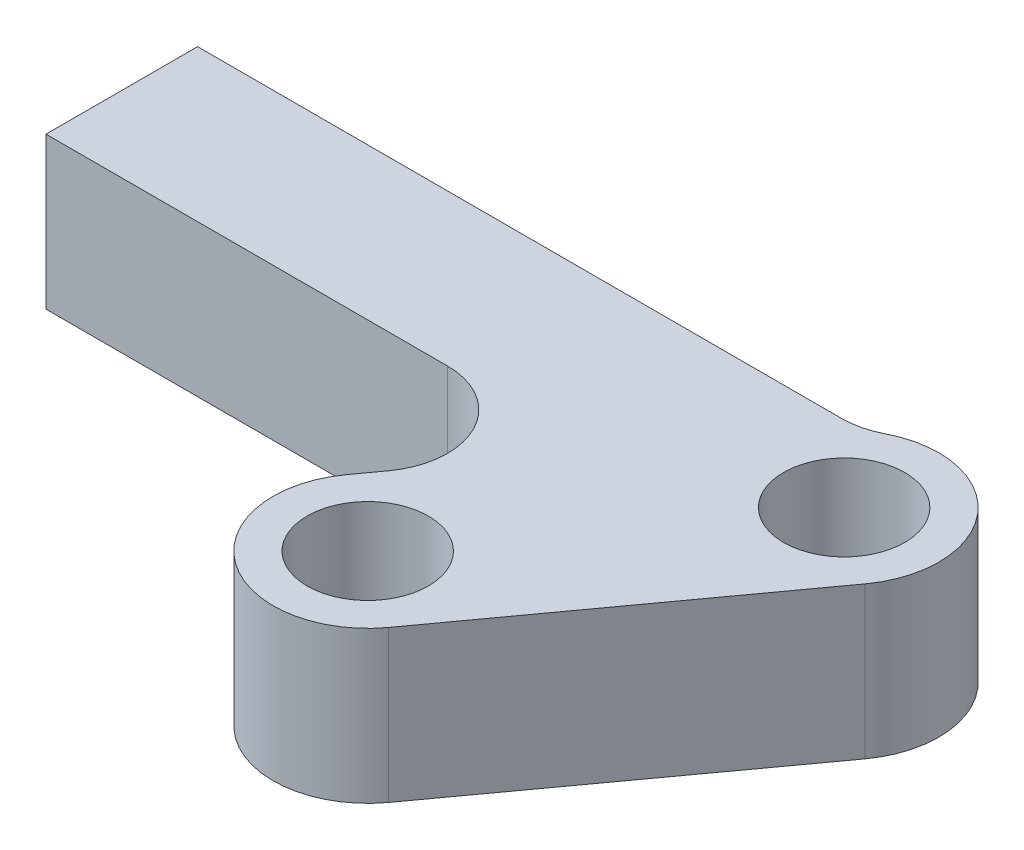
ISO-10303-21;
HEADER;
FILE_DESCRIPTION(('STEP AP214'),'2;1');
FILE_NAME('part.step','',(''),(''),'','','');
FILE_SCHEMA(('AUTOMOTIVE_DESIGN { 1 0 10303 214 1 1 1 1 }'));
ENDSEC;
DATA;
#1=APPLICATION_CONTEXT('core data for automotive mechanical design processes');
#2=APPLICATION_PROTOCOL_DEFINITION('international standard','automotive_design',2000,#1);
#3=PRODUCT_CONTEXT('',#1,'mechanical');
#4=PRODUCT('Part','Part','',(#3));
#5=PRODUCT_RELATED_PRODUCT_CATEGORY('part','',(#4));
#6=PRODUCT_DEFINITION_FORMATION('','',#4);
#7=PRODUCT_DEFINITION_CONTEXT('part definition',#1,'design');
#8=PRODUCT_DEFINITION('design','',#6,#7);
#9=PRODUCT_DEFINITION_SHAPE('','',#8);
#10=(LENGTH_UNIT() NAMED_UNIT(*) SI_UNIT(.MILLI.,.METRE.));
#11=(NAMED_UNIT(*) PLANE_ANGLE_UNIT() SI_UNIT($,.RADIAN.));
#12=(NAMED_UNIT(*) SI_UNIT($,.STERADIAN.) SOLID_ANGLE_UNIT());
#13=UNCERTAINTY_MEASURE_WITH_UNIT(LENGTH_MEASURE(1.E-05),#10,'distance_accuracy_value','');
#14=(GEOMETRIC_REPRESENTATION_CONTEXT(3) GLOBAL_UNCERTAINTY_ASSIGNED_CONTEXT((#13)) GLOBAL_UNIT_ASSIGNED_CONTEXT((#10,
#11,#12)) REPRESENTATION_CONTEXT('',''));
#15=CARTESIAN_POINT('',(0.,0.,0.));
#16=DIRECTION('',(0.,0.,1.));
#17=DIRECTION('',(1.,0.,0.));
#18=AXIS2_PLACEMENT_3D('',#15,#16,#17);
#19=CARTESIAN_POINT('',(-2.06155281280883,4.,-4.));
#20=DIRECTION('',(0.,1.,0.));
#21=DIRECTION('',(0.,0.,1.));
#22=AXIS2_PLACEMENT_3D('',#19,#20,#21);
#23=PLANE('',#22);
#24=CARTESIAN_POINT('',(0.,4.,0.));
#25=DIRECTION('',(0.,1.,0.));
#26=DIRECTION('',(0.,0.,1.));
#27=AXIS2_PLACEMENT_3D('',#24,#25,#26);
#28=CIRCLE('',#27,1.6);
#29=CARTESIAN_POINT('',(0.,4.,1.6));
#30=VERTEX_POINT('',#29);
#31=EDGE_CURVE('E142',#30,#30,#28,.T.);
#32=ORIENTED_EDGE('',*,*,#31,.F.);
#33=EDGE_LOOP('',(#32));
#34=FACE_BOUND('',#33,.T.);
#35=CARTESIAN_POINT('',(-2.06155281280883,4.,-4.));
#36=DIRECTION('',(0.,-1.,0.));
#37=DIRECTION('',(0.,0.,1.));
#38=AXIS2_PLACEMENT_3D('',#35,#36,#37);
#39=CIRCLE('',#38,2.);
#40=CARTESIAN_POINT('',(-1.14530711822713,4.,-2.22222222222222));
#41=VERTEX_POINT('',#40);
#42=CARTESIAN_POINT('',(-2.06155281280883,4.,-2.));
#43=VERTEX_POINT('',#42);
#44=EDGE_CURVE('E155',#41,#43,#39,.T.);
#45=ORIENTED_EDGE('',*,*,#44,.T.);
#46=DIRECTION('',(-1.,0.,0.));
#47=VECTOR('',#46,1.);
#48=CARTESIAN_POINT('',(-19.0615528128088,4.,-2.));
#49=LINE('',#48,#47);
#50=CARTESIAN_POINT('',(-19.0615528128088,4.,-2.));
#51=VERTEX_POINT('',#50);
#52=EDGE_CURVE('E98',#43,#51,#49,.T.);
#53=ORIENTED_EDGE('',*,*,#52,.T.);
#54=DIRECTION('',(0.,0.,1.));
#55=VECTOR('',#54,1.);
#56=CARTESIAN_POINT('',(-19.0615528128088,4.,2.));
#57=LINE('',#56,#55);
#58=CARTESIAN_POINT('',(-19.0615528128088,4.,2.));
#59=VERTEX_POINT('',#58);
#60=EDGE_CURVE('E173',#51,#59,#57,.T.);
#61=ORIENTED_EDGE('',*,*,#60,.T.);
#62=DIRECTION('',(1.,0.,0.));
#63=VECTOR('',#62,1.);
#64=CARTESIAN_POINT('',(-19.0615528128088,4.,2.));
#65=LINE('',#64,#63);
#66=CARTESIAN_POINT('',(-8.46847601077048,4.,2.));
#67=VERTEX_POINT('',#66);
#68=EDGE_CURVE('E190',#59,#67,#65,.T.);
#69=ORIENTED_EDGE('',*,*,#68,.T.);
#70=CARTESIAN_POINT('',(-8.46847601077048,4.,4.));
#71=DIRECTION('',(0.,-1.,0.));
#72=DIRECTION('',(0.,0.,-1.));
#73=AXIS2_PLACEMENT_3D('',#70,#71,#72);
#74=CIRCLE('',#73,2.);
#75=CARTESIAN_POINT('',(-6.85044202202058,4.,5.17557050458494));
#76=VERTEX_POINT('',#75);
#77=EDGE_CURVE('E189',#67,#76,#74,.T.);
#78=ORIENTED_EDGE('',*,*,#77,.T.);
#79=DIRECTION('',(-0.587785252292471,0.,0.809016994374949));
#80=VECTOR('',#79,1.);
#81=CARTESIAN_POINT('',(-6.85044202202058,4.,5.17557050458494));
#82=LINE('',#81,#80);
#83=CARTESIAN_POINT('',(-7.31260975656961,4.,5.81168981864336));
#84=VERTEX_POINT('',#83);
#85=EDGE_CURVE('E120',#76,#84,#82,.T.);
#86=ORIENTED_EDGE('',*,*,#85,.T.);
#87=CARTESIAN_POINT('',(-5.29006727063224,4.,7.28115294937454));
#88=DIRECTION('',(0.,1.,0.));
#89=DIRECTION('',(0.,0.,1.));
#90=AXIS2_PLACEMENT_3D('',#87,#88,#89);
#91=CIRCLE('',#90,2.5);
#92=CARTESIAN_POINT('',(-3.26752478469487,4.,8.75061608010572));
#93=VERTEX_POINT('',#92);
#94=EDGE_CURVE('E114',#84,#93,#91,.T.);
#95=ORIENTED_EDGE('',*,*,#94,.T.);
#96=DIRECTION('',(0.587785252292471,0.,-0.809016994374949));
#97=VECTOR('',#96,1.);
#98=CARTESIAN_POINT('',(2.02254248593737,4.,1.46946313073118));
#99=LINE('',#98,#97);
#100=CARTESIAN_POINT('',(2.02254248593737,4.,1.46946313073118));
#101=VERTEX_POINT('',#100);
#102=EDGE_CURVE('E118',#93,#101,#99,.T.);
#103=ORIENTED_EDGE('',*,*,#102,.T.);
#104=CARTESIAN_POINT('',(0.,4.,0.));
#105=DIRECTION('',(0.,1.,0.));
#106=DIRECTION('',(0.,0.,1.));
#107=AXIS2_PLACEMENT_3D('',#104,#105,#106);
#108=CIRCLE('',#107,2.5);
#109=EDGE_CURVE('E52',#101,#41,#108,.T.);
#110=ORIENTED_EDGE('',*,*,#109,.T.);
#111=EDGE_LOOP('',(#45,#53,#61,#69,#78,#86,#95,#103,#110));
#112=FACE_BOUND('',#111,.T.);
#113=CARTESIAN_POINT('',(-5.29006727063224,4.,7.28115294937454));
#114=DIRECTION('',(0.,1.,0.));
#115=DIRECTION('',(0.,0.,1.));
#116=AXIS2_PLACEMENT_3D('',#113,#114,#115);
#117=CIRCLE('',#116,1.6);
#118=CARTESIAN_POINT('',(-5.29006727063224,4.,8.88115294937453));
#119=VERTEX_POINT('',#118);
#120=EDGE_CURVE('E200',#119,#119,#117,.T.);
#121=ORIENTED_EDGE('',*,*,#120,.F.);
#122=EDGE_LOOP('',(#121));
#123=FACE_BOUND('',#122,.T.);
#124=ADVANCED_FACE('F35',(#34,#112,#123),#23,.T.);
#125=CARTESIAN_POINT('',(-2.06155281280883,0.,-4.));
#126=DIRECTION('',(0.,1.,0.));
#127=DIRECTION('',(0.,0.,1.));
#128=AXIS2_PLACEMENT_3D('',#125,#126,#127);
#129=PLANE('',#128);
#130=CARTESIAN_POINT('',(-2.06155281280883,0.,-4.));
#131=DIRECTION('',(0.,-1.,0.));
#132=DIRECTION('',(0.,0.,1.));
#133=AXIS2_PLACEMENT_3D('',#130,#131,#132);
#134=CIRCLE('',#133,2.);
#135=CARTESIAN_POINT('',(-1.14530711822713,0.,-2.22222222222222));
#136=VERTEX_POINT('',#135);
#137=CARTESIAN_POINT('',(-2.06155281280883,0.,-2.));
#138=VERTEX_POINT('',#137);
#139=EDGE_CURVE('E138',#136,#138,#134,.T.);
#140=ORIENTED_EDGE('',*,*,#139,.F.);
#141=CARTESIAN_POINT('',(0.,0.,0.));
#142=DIRECTION('',(0.,1.,0.));
#143=DIRECTION('',(0.,0.,1.));
#144=AXIS2_PLACEMENT_3D('',#141,#142,#143);
#145=CIRCLE('',#144,2.5);
#146=CARTESIAN_POINT('',(2.02254248593737,0.,1.46946313073118));
#147=VERTEX_POINT('',#146);
#148=EDGE_CURVE('E90',#147,#136,#145,.T.);
#149=ORIENTED_EDGE('',*,*,#148,.F.);
#150=DIRECTION('',(0.587785252292471,0.,-0.809016994374949));
#151=VECTOR('',#150,1.);
#152=CARTESIAN_POINT('',(2.02254248593737,0.,1.46946313073118));
#153=LINE('',#152,#151);
#154=CARTESIAN_POINT('',(-3.26752478469487,0.,8.75061608010572));
#155=VERTEX_POINT('',#154);
#156=EDGE_CURVE('E84',#155,#147,#153,.T.);
#157=ORIENTED_EDGE('',*,*,#156,.F.);
#158=CARTESIAN_POINT('',(-5.29006727063224,0.,7.28115294937454));
#159=DIRECTION('',(0.,1.,0.));
#160=DIRECTION('',(0.,0.,1.));
#161=AXIS2_PLACEMENT_3D('',#158,#159,#160);
#162=CIRCLE('',#161,2.5);
#163=CARTESIAN_POINT('',(-7.31260975656961,0.,5.81168981864336));
#164=VERTEX_POINT('',#163);
#165=EDGE_CURVE('E128',#164,#155,#162,.T.);
#166=ORIENTED_EDGE('',*,*,#165,.F.);
#167=DIRECTION('',(-0.587785252292471,0.,0.809016994374949));
#168=VECTOR('',#167,1.);
#169=CARTESIAN_POINT('',(-6.85044202202058,0.,5.17557050458494));
#170=LINE('',#169,#168);
#171=CARTESIAN_POINT('',(-6.85044202202058,0.,5.17557050458494));
#172=VERTEX_POINT('',#171);
#173=EDGE_CURVE('E150',#172,#164,#170,.T.);
#174=ORIENTED_EDGE('',*,*,#173,.F.);
#175=CARTESIAN_POINT('',(-8.46847601077048,0.,4.));
#176=DIRECTION('',(0.,-1.,0.));
#177=DIRECTION('',(0.,0.,-1.));
#178=AXIS2_PLACEMENT_3D('',#175,#176,#177);
#179=CIRCLE('',#178,2.);
#180=CARTESIAN_POINT('',(-8.46847601077048,0.,2.));
#181=VERTEX_POINT('',#180);
#182=EDGE_CURVE('E148',#181,#172,#179,.T.);
#183=ORIENTED_EDGE('',*,*,#182,.F.);
#184=DIRECTION('',(1.,0.,0.));
#185=VECTOR('',#184,1.);
#186=CARTESIAN_POINT('',(-19.0615528128088,0.,2.));
#187=LINE('',#186,#185);
#188=CARTESIAN_POINT('',(-19.0615528128088,0.,2.));
#189=VERTEX_POINT('',#188);
#190=EDGE_CURVE('E146',#189,#181,#187,.T.);
#191=ORIENTED_EDGE('',*,*,#190,.F.);
#192=DIRECTION('',(0.,0.,1.));
#193=VECTOR('',#192,1.);
#194=CARTESIAN_POINT('',(-19.0615528128088,0.,2.));
#195=LINE('',#194,#193);
#196=CARTESIAN_POINT('',(-19.0615528128088,0.,-2.));
#197=VERTEX_POINT('',#196);
#198=EDGE_CURVE('E144',#197,#189,#195,.T.);
#199=ORIENTED_EDGE('',*,*,#198,.F.);
#200=DIRECTION('',(-1.,0.,0.));
#201=VECTOR('',#200,1.);
#202=CARTESIAN_POINT('',(-19.0615528128088,0.,-2.));
#203=LINE('',#202,#201);
#204=EDGE_CURVE('E141',#138,#197,#203,.T.);
#205=ORIENTED_EDGE('',*,*,#204,.F.);
#206=EDGE_LOOP('',(#140,#149,#157,#166,#174,#183,#191,#199,#205));
#207=FACE_BOUND('',#206,.T.);
#208=CARTESIAN_POINT('',(0.,0.,0.));
#209=DIRECTION('',(0.,1.,0.));
#210=DIRECTION('',(0.,0.,1.));
#211=AXIS2_PLACEMENT_3D('',#208,#209,#210);
#212=CIRCLE('',#211,1.6);
#213=CARTESIAN_POINT('',(0.,0.,1.6));
#214=VERTEX_POINT('',#213);
#215=EDGE_CURVE('E197',#214,#214,#212,.T.);
#216=ORIENTED_EDGE('',*,*,#215,.T.);
#217=EDGE_LOOP('',(#216));
#218=FACE_BOUND('',#217,.T.);
#219=CARTESIAN_POINT('',(-5.29006727063224,0.,7.28115294937454));
#220=DIRECTION('',(0.,1.,0.));
#221=DIRECTION('',(0.,0.,1.));
#222=AXIS2_PLACEMENT_3D('',#219,#220,#221);
#223=CIRCLE('',#222,1.6);
#224=CARTESIAN_POINT('',(-5.29006727063224,0.,8.88115294937453));
#225=VERTEX_POINT('',#224);
#226=EDGE_CURVE('E203',#225,#225,#223,.T.);
#227=ORIENTED_EDGE('',*,*,#226,.T.);
#228=EDGE_LOOP('',(#227));
#229=FACE_BOUND('',#228,.T.);
#230=ADVANCED_FACE('F177',(#207,#218,#229),#129,.F.);
#231=CARTESIAN_POINT('',(-2.06155281280883,4.,-4.));
#232=DIRECTION('',(0.,-1.,0.));
#233=DIRECTION('',(0.,0.,-1.));
#234=AXIS2_PLACEMENT_3D('',#231,#232,#233);
#235=CYLINDRICAL_SURFACE('',#234,2.);
#236=ORIENTED_EDGE('',*,*,#139,.T.);
#237=DIRECTION('',(0.,-1.,0.));
#238=VECTOR('',#237,1.);
#239=CARTESIAN_POINT('',(-2.06155281280883,4.,-2.));
#240=LINE('',#239,#238);
#241=EDGE_CURVE('E11',#43,#138,#240,.T.);
#242=ORIENTED_EDGE('',*,*,#241,.F.);
#243=ORIENTED_EDGE('',*,*,#44,.F.);
#244=DIRECTION('',(0.,-1.,0.));
#245=VECTOR('',#244,1.);
#246=CARTESIAN_POINT('',(-1.14530711822713,4.,-2.22222222222222));
#247=LINE('',#246,#245);
#248=EDGE_CURVE('E134',#41,#136,#247,.T.);
#249=ORIENTED_EDGE('',*,*,#248,.T.);
#250=EDGE_LOOP('',(#236,#242,#243,#249));
#251=FACE_BOUND('',#250,.T.);
#252=ADVANCED_FACE('F37',(#251),#235,.F.);
#253=CARTESIAN_POINT('',(-19.0615528128088,4.,-2.));
#254=DIRECTION('',(0.,0.,1.));
#255=DIRECTION('',(1.,0.,0.));
#256=AXIS2_PLACEMENT_3D('',#253,#254,#255);
#257=PLANE('',#256);
#258=ORIENTED_EDGE('',*,*,#204,.T.);
#259=DIRECTION('',(0.,-1.,0.));
#260=VECTOR('',#259,1.);
#261=CARTESIAN_POINT('',(-19.0615528128088,4.,-2.));
#262=LINE('',#261,#260);
#263=EDGE_CURVE('E44',#51,#197,#262,.T.);
#264=ORIENTED_EDGE('',*,*,#263,.F.);
#265=ORIENTED_EDGE('',*,*,#52,.F.);
#266=ORIENTED_EDGE('',*,*,#241,.T.);
#267=EDGE_LOOP('',(#258,#264,#265,#266));
#268=FACE_BOUND('',#267,.T.);
#269=ADVANCED_FACE('F239',(#268),#257,.F.);
#270=CARTESIAN_POINT('',(-19.0615528128088,4.,2.));
#271=DIRECTION('',(1.,0.,0.));
#272=DIRECTION('',(0.,0.,-1.));
#273=AXIS2_PLACEMENT_3D('',#270,#271,#272);
#274=PLANE('',#273);
#275=ORIENTED_EDGE('',*,*,#198,.T.);
#276=DIRECTION('',(0.,-1.,0.));
#277=VECTOR('',#276,1.);
#278=CARTESIAN_POINT('',(-19.0615528128088,4.,2.));
#279=LINE('',#278,#277);
#280=EDGE_CURVE('E165',#59,#189,#279,.T.);
#281=ORIENTED_EDGE('',*,*,#280,.F.);
#282=ORIENTED_EDGE('',*,*,#60,.F.);
#283=ORIENTED_EDGE('',*,*,#263,.T.);
#284=EDGE_LOOP('',(#275,#281,#282,#283));
#285=FACE_BOUND('',#284,.T.);
#286=ADVANCED_FACE('F171',(#285),#274,.F.);
#287=CARTESIAN_POINT('',(-19.0615528128088,4.,2.));
#288=DIRECTION('',(0.,0.,-1.));
#289=DIRECTION('',(-1.,0.,0.));
#290=AXIS2_PLACEMENT_3D('',#287,#288,#289);
#291=PLANE('',#290);
#292=ORIENTED_EDGE('',*,*,#190,.T.);
#293=DIRECTION('',(0.,-1.,0.));
#294=VECTOR('',#293,1.);
#295=CARTESIAN_POINT('',(-8.46847601077048,4.,2.));
#296=LINE('',#295,#294);
#297=EDGE_CURVE('E162',#67,#181,#296,.T.);
#298=ORIENTED_EDGE('',*,*,#297,.F.);
#299=ORIENTED_EDGE('',*,*,#68,.F.);
#300=ORIENTED_EDGE('',*,*,#280,.T.);
#301=EDGE_LOOP('',(#292,#298,#299,#300));
#302=FACE_BOUND('',#301,.T.);
#303=ADVANCED_FACE('F183',(#302),#291,.F.);
#304=CARTESIAN_POINT('',(-8.46847601077048,4.,4.));
#305=DIRECTION('',(0.,-1.,0.));
#306=DIRECTION('',(0.,0.,-1.));
#307=AXIS2_PLACEMENT_3D('',#304,#305,#306);
#308=CYLINDRICAL_SURFACE('',#307,2.);
#309=ORIENTED_EDGE('',*,*,#182,.T.);
#310=DIRECTION('',(0.,-1.,0.));
#311=VECTOR('',#310,1.);
#312=CARTESIAN_POINT('',(-6.85044202202058,4.,5.17557050458494));
#313=LINE('',#312,#311);
#314=EDGE_CURVE('E159',#76,#172,#313,.T.);
#315=ORIENTED_EDGE('',*,*,#314,.F.);
#316=ORIENTED_EDGE('',*,*,#77,.F.);
#317=ORIENTED_EDGE('',*,*,#297,.T.);
#318=EDGE_LOOP('',(#309,#315,#316,#317));
#319=FACE_BOUND('',#318,.T.);
#320=ADVANCED_FACE('F187',(#319),#308,.F.);
#321=CARTESIAN_POINT('',(-6.85044202202058,4.,5.17557050458494));
#322=DIRECTION('',(0.809016994374949,0.,0.587785252292471));
#323=DIRECTION('',(0.587785252292471,0.,-0.809016994374949));
#324=AXIS2_PLACEMENT_3D('',#321,#322,#323);
#325=PLANE('',#324);
#326=ORIENTED_EDGE('',*,*,#173,.T.);
#327=DIRECTION('',(0.,-1.,0.));
#328=VECTOR('',#327,1.);
#329=CARTESIAN_POINT('',(-7.31260975656961,4.,5.81168981864336));
#330=LINE('',#329,#328);
#331=EDGE_CURVE('E129',#84,#164,#330,.T.);
#332=ORIENTED_EDGE('',*,*,#331,.F.);
#333=ORIENTED_EDGE('',*,*,#85,.F.);
#334=ORIENTED_EDGE('',*,*,#314,.T.);
#335=EDGE_LOOP('',(#326,#332,#333,#334));
#336=FACE_BOUND('',#335,.T.);
#337=ADVANCED_FACE('F230',(#336),#325,.F.);
#338=CARTESIAN_POINT('',(-5.29006727063224,4.,7.28115294937454));
#339=DIRECTION('',(0.,-1.,0.));
#340=DIRECTION('',(0.,0.,-1.));
#341=AXIS2_PLACEMENT_3D('',#338,#339,#340);
#342=CYLINDRICAL_SURFACE('',#341,2.5);
#343=ORIENTED_EDGE('',*,*,#165,.T.);
#344=DIRECTION('',(0.,-1.,0.));
#345=VECTOR('',#344,1.);
#346=CARTESIAN_POINT('',(-3.26752478469487,4.,8.75061608010572));
#347=LINE('',#346,#345);
#348=EDGE_CURVE('E125',#93,#155,#347,.T.);
#349=ORIENTED_EDGE('',*,*,#348,.F.);
#350=ORIENTED_EDGE('',*,*,#94,.F.);
#351=ORIENTED_EDGE('',*,*,#331,.T.);
#352=EDGE_LOOP('',(#343,#349,#350,#351));
#353=FACE_BOUND('',#352,.T.);
#354=ADVANCED_FACE('F126',(#353),#342,.T.);
#355=CARTESIAN_POINT('',(2.02254248593737,4.,1.46946313073118));
#356=DIRECTION('',(-0.809016994374949,0.,-0.587785252292471));
#357=DIRECTION('',(-0.587785252292471,0.,0.809016994374949));
#358=AXIS2_PLACEMENT_3D('',#355,#356,#357);
#359=PLANE('',#358);
#360=ORIENTED_EDGE('',*,*,#156,.T.);
#361=DIRECTION('',(0.,-1.,0.));
#362=VECTOR('',#361,1.);
#363=CARTESIAN_POINT('',(2.02254248593737,4.,1.46946313073118));
#364=LINE('',#363,#362);
#365=EDGE_CURVE('E130',#101,#147,#364,.T.);
#366=ORIENTED_EDGE('',*,*,#365,.F.);
#367=ORIENTED_EDGE('',*,*,#102,.F.);
#368=ORIENTED_EDGE('',*,*,#348,.T.);
#369=EDGE_LOOP('',(#360,#366,#367,#368));
#370=FACE_BOUND('',#369,.T.);
#371=ADVANCED_FACE('F132',(#370),#359,.F.);
#372=CARTESIAN_POINT('',(0.,4.,0.));
#373=DIRECTION('',(0.,-1.,0.));
#374=DIRECTION('',(0.,0.,-1.));
#375=AXIS2_PLACEMENT_3D('',#372,#373,#374);
#376=CYLINDRICAL_SURFACE('',#375,2.5);
#377=ORIENTED_EDGE('',*,*,#148,.T.);
#378=ORIENTED_EDGE('',*,*,#248,.F.);
#379=ORIENTED_EDGE('',*,*,#109,.F.);
#380=ORIENTED_EDGE('',*,*,#365,.T.);
#381=EDGE_LOOP('',(#377,#378,#379,#380));
#382=FACE_BOUND('',#381,.T.);
#383=ADVANCED_FACE('F223',(#382),#376,.T.);
#384=CARTESIAN_POINT('',(0.,4.,0.));
#385=DIRECTION('',(0.,-1.,0.));
#386=DIRECTION('',(0.,0.,-1.));
#387=AXIS2_PLACEMENT_3D('',#384,#385,#386);
#388=CYLINDRICAL_SURFACE('',#387,1.6);
#389=ORIENTED_EDGE('',*,*,#31,.T.);
#390=EDGE_LOOP('',(#389));
#391=FACE_BOUND('',#390,.T.);
#392=ORIENTED_EDGE('',*,*,#215,.F.);
#393=EDGE_LOOP('',(#392));
#394=FACE_BOUND('',#393,.T.);
#395=ADVANCED_FACE('F220',(#391,#394),#388,.F.);
#396=CARTESIAN_POINT('',(-5.29006727063224,4.,7.28115294937454));
#397=DIRECTION('',(0.,-1.,0.));
#398=DIRECTION('',(0.,0.,-1.));
#399=AXIS2_PLACEMENT_3D('',#396,#397,#398);
#400=CYLINDRICAL_SURFACE('',#399,1.6);
#401=ORIENTED_EDGE('',*,*,#120,.T.);
#402=EDGE_LOOP('',(#401));
#403=FACE_BOUND('',#402,.T.);
#404=ORIENTED_EDGE('',*,*,#226,.F.);
#405=EDGE_LOOP('',(#404));
#406=FACE_BOUND('',#405,.T.);
#407=ADVANCED_FACE('F209',(#403,#406),#400,.F.);
#408=CLOSED_SHELL('',(#124,#230,#252,#269,#286,#303,#320,#337,#354,#371,#383,#395,#407));
#409=MANIFOLD_SOLID_BREP('B2',#408);
#410=ADVANCED_BREP_SHAPE_REPRESENTATION('',(#18,#409),#14);
#411=SHAPE_DEFINITION_REPRESENTATION(#9,#410);
ENDSEC;
END-ISO-10303-21;
